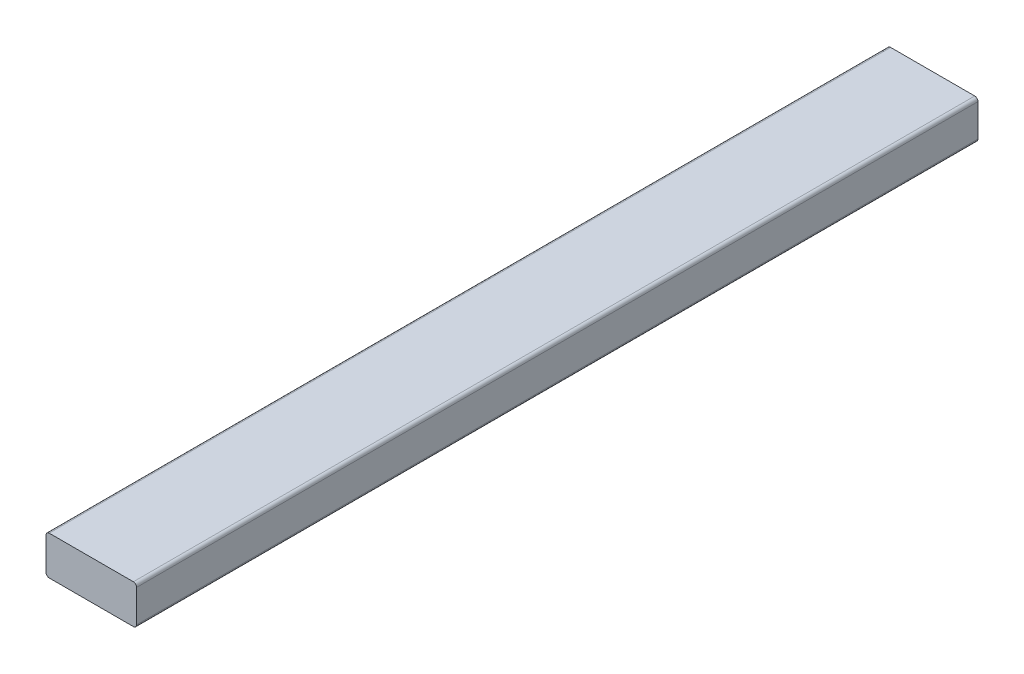
ISO-10303-21;
HEADER;
FILE_DESCRIPTION(('STEP AP214'),'2;1');
FILE_NAME('part.step','',(''),(''),'','','');
FILE_SCHEMA(('AUTOMOTIVE_DESIGN { 1 0 10303 214 1 1 1 1 }'));
ENDSEC;
DATA;
#1=APPLICATION_CONTEXT('core data for automotive mechanical design processes');
#2=APPLICATION_PROTOCOL_DEFINITION('international standard','automotive_design',2000,#1);
#3=PRODUCT_CONTEXT('',#1,'mechanical');
#4=PRODUCT('Part','Part','',(#3));
#5=PRODUCT_RELATED_PRODUCT_CATEGORY('part','',(#4));
#6=PRODUCT_DEFINITION_FORMATION('','',#4);
#7=PRODUCT_DEFINITION_CONTEXT('part definition',#1,'design');
#8=PRODUCT_DEFINITION('design','',#6,#7);
#9=PRODUCT_DEFINITION_SHAPE('','',#8);
#10=(LENGTH_UNIT() NAMED_UNIT(*) SI_UNIT(.MILLI.,.METRE.));
#11=(NAMED_UNIT(*) PLANE_ANGLE_UNIT() SI_UNIT($,.RADIAN.));
#12=(NAMED_UNIT(*) SI_UNIT($,.STERADIAN.) SOLID_ANGLE_UNIT());
#13=UNCERTAINTY_MEASURE_WITH_UNIT(LENGTH_MEASURE(1.E-05),#10,'distance_accuracy_value','');
#14=(GEOMETRIC_REPRESENTATION_CONTEXT(3) GLOBAL_UNCERTAINTY_ASSIGNED_CONTEXT((#13)) GLOBAL_UNIT_ASSIGNED_CONTEXT((#10,
#11,#12)) REPRESENTATION_CONTEXT('',''));
#15=CARTESIAN_POINT('',(0.,0.,0.));
#16=DIRECTION('',(0.,0.,1.));
#17=DIRECTION('',(1.,0.,0.));
#18=AXIS2_PLACEMENT_3D('',#15,#16,#17);
#19=CARTESIAN_POINT('',(44.45,19.05,412.75));
#20=DIRECTION('',(-1.,0.,0.));
#21=DIRECTION('',(0.,0.,1.));
#22=AXIS2_PLACEMENT_3D('',#19,#20,#21);
#23=PLANE('',#22);
#24=DIRECTION('',(0.,1.,0.));
#25=VECTOR('',#24,1.);
#26=CARTESIAN_POINT('',(44.45,19.05,412.75));
#27=LINE('',#26,#25);
#28=CARTESIAN_POINT('',(44.45,-15.875,412.75));
#29=VERTEX_POINT('',#28);
#30=CARTESIAN_POINT('',(44.45,15.875,412.75));
#31=VERTEX_POINT('',#30);
#32=EDGE_CURVE('E119',#29,#31,#27,.T.);
#33=ORIENTED_EDGE('',*,*,#32,.F.);
#34=DIRECTION('',(0.,0.,-1.));
#35=VECTOR('',#34,1.);
#36=CARTESIAN_POINT('',(44.45,-15.875,412.75));
#37=LINE('',#36,#35);
#38=CARTESIAN_POINT('',(44.45,-15.875,-412.75));
#39=VERTEX_POINT('',#38);
#40=EDGE_CURVE('E104',#29,#39,#37,.T.);
#41=ORIENTED_EDGE('',*,*,#40,.T.);
#42=DIRECTION('',(0.,1.,0.));
#43=VECTOR('',#42,1.);
#44=CARTESIAN_POINT('',(44.45,19.05,-412.75));
#45=LINE('',#44,#43);
#46=CARTESIAN_POINT('',(44.45,15.875,-412.75));
#47=VERTEX_POINT('',#46);
#48=EDGE_CURVE('E116',#39,#47,#45,.T.);
#49=ORIENTED_EDGE('',*,*,#48,.T.);
#50=DIRECTION('',(0.,0.,-1.));
#51=VECTOR('',#50,1.);
#52=CARTESIAN_POINT('',(44.45,15.875,412.75));
#53=LINE('',#52,#51);
#54=EDGE_CURVE('E121',#47,#31,#53,.F.);
#55=ORIENTED_EDGE('',*,*,#54,.T.);
#56=EDGE_LOOP('',(#33,#41,#49,#55));
#57=FACE_BOUND('',#56,.T.);
#58=ADVANCED_FACE('F34',(#57),#23,.F.);
#59=CARTESIAN_POINT('',(-44.45,19.05,412.75));
#60=DIRECTION('',(0.,-1.,0.));
#61=DIRECTION('',(0.,0.,-1.));
#62=AXIS2_PLACEMENT_3D('',#59,#60,#61);
#63=PLANE('',#62);
#64=DIRECTION('',(-1.,0.,0.));
#65=VECTOR('',#64,1.);
#66=CARTESIAN_POINT('',(-44.45,19.05,-412.75));
#67=LINE('',#66,#65);
#68=CARTESIAN_POINT('',(41.275,19.05,-412.75));
#69=VERTEX_POINT('',#68);
#70=CARTESIAN_POINT('',(-41.275,19.05,-412.75));
#71=VERTEX_POINT('',#70);
#72=EDGE_CURVE('E125',#69,#71,#67,.T.);
#73=ORIENTED_EDGE('',*,*,#72,.T.);
#74=DIRECTION('',(0.,0.,-1.));
#75=VECTOR('',#74,1.);
#76=CARTESIAN_POINT('',(-41.275,19.05,412.75));
#77=LINE('',#76,#75);
#78=CARTESIAN_POINT('',(-41.275,19.05,412.75));
#79=VERTEX_POINT('',#78);
#80=EDGE_CURVE('E11',#71,#79,#77,.F.);
#81=ORIENTED_EDGE('',*,*,#80,.T.);
#82=DIRECTION('',(-1.,0.,0.));
#83=VECTOR('',#82,1.);
#84=CARTESIAN_POINT('',(-44.45,19.05,412.75));
#85=LINE('',#84,#83);
#86=CARTESIAN_POINT('',(41.275,19.05,412.75));
#87=VERTEX_POINT('',#86);
#88=EDGE_CURVE('E161',#87,#79,#85,.T.);
#89=ORIENTED_EDGE('',*,*,#88,.F.);
#90=DIRECTION('',(0.,0.,-1.));
#91=VECTOR('',#90,1.);
#92=CARTESIAN_POINT('',(41.275,19.05,412.75));
#93=LINE('',#92,#91);
#94=EDGE_CURVE('E42',#87,#69,#93,.T.);
#95=ORIENTED_EDGE('',*,*,#94,.T.);
#96=EDGE_LOOP('',(#73,#81,#89,#95));
#97=FACE_BOUND('',#96,.T.);
#98=ADVANCED_FACE('F159',(#97),#63,.F.);
#99=CARTESIAN_POINT('',(-44.45,19.05,412.75));
#100=DIRECTION('',(1.,0.,0.));
#101=DIRECTION('',(0.,0.,-1.));
#102=AXIS2_PLACEMENT_3D('',#99,#100,#101);
#103=PLANE('',#102);
#104=DIRECTION('',(0.,-1.,0.));
#105=VECTOR('',#104,1.);
#106=CARTESIAN_POINT('',(-44.45,19.05,-412.75));
#107=LINE('',#106,#105);
#108=CARTESIAN_POINT('',(-44.45,15.875,-412.75));
#109=VERTEX_POINT('',#108);
#110=CARTESIAN_POINT('',(-44.45,-15.875,-412.75));
#111=VERTEX_POINT('',#110);
#112=EDGE_CURVE('E128',#109,#111,#107,.T.);
#113=ORIENTED_EDGE('',*,*,#112,.T.);
#114=DIRECTION('',(0.,0.,-1.));
#115=VECTOR('',#114,1.);
#116=CARTESIAN_POINT('',(-44.45,-15.875,412.75));
#117=LINE('',#116,#115);
#118=CARTESIAN_POINT('',(-44.45,-15.875,412.75));
#119=VERTEX_POINT('',#118);
#120=EDGE_CURVE('E49',#111,#119,#117,.F.);
#121=ORIENTED_EDGE('',*,*,#120,.T.);
#122=DIRECTION('',(0.,-1.,0.));
#123=VECTOR('',#122,1.);
#124=CARTESIAN_POINT('',(-44.45,19.05,412.75));
#125=LINE('',#124,#123);
#126=CARTESIAN_POINT('',(-44.45,15.875,412.75));
#127=VERTEX_POINT('',#126);
#128=EDGE_CURVE('E169',#127,#119,#125,.T.);
#129=ORIENTED_EDGE('',*,*,#128,.F.);
#130=DIRECTION('',(0.,0.,-1.));
#131=VECTOR('',#130,1.);
#132=CARTESIAN_POINT('',(-44.45,15.875,412.75));
#133=LINE('',#132,#131);
#134=EDGE_CURVE('E152',#127,#109,#133,.T.);
#135=ORIENTED_EDGE('',*,*,#134,.T.);
#136=EDGE_LOOP('',(#113,#121,#129,#135));
#137=FACE_BOUND('',#136,.T.);
#138=ADVANCED_FACE('F168',(#137),#103,.F.);
#139=CARTESIAN_POINT('',(-44.45,-19.05,412.75));
#140=DIRECTION('',(0.,1.,0.));
#141=DIRECTION('',(0.,0.,1.));
#142=AXIS2_PLACEMENT_3D('',#139,#140,#141);
#143=PLANE('',#142);
#144=DIRECTION('',(1.,0.,0.));
#145=VECTOR('',#144,1.);
#146=CARTESIAN_POINT('',(-44.45,-19.05,-412.75));
#147=LINE('',#146,#145);
#148=CARTESIAN_POINT('',(-41.275,-19.05,-412.75));
#149=VERTEX_POINT('',#148);
#150=CARTESIAN_POINT('',(41.275,-19.05,-412.75));
#151=VERTEX_POINT('',#150);
#152=EDGE_CURVE('E135',#149,#151,#147,.T.);
#153=ORIENTED_EDGE('',*,*,#152,.T.);
#154=DIRECTION('',(0.,0.,-1.));
#155=VECTOR('',#154,1.);
#156=CARTESIAN_POINT('',(41.275,-19.05,412.75));
#157=LINE('',#156,#155);
#158=CARTESIAN_POINT('',(41.275,-19.05,412.75));
#159=VERTEX_POINT('',#158);
#160=EDGE_CURVE('E105',#151,#159,#157,.F.);
#161=ORIENTED_EDGE('',*,*,#160,.T.);
#162=DIRECTION('',(1.,0.,0.));
#163=VECTOR('',#162,1.);
#164=CARTESIAN_POINT('',(-44.45,-19.05,412.75));
#165=LINE('',#164,#163);
#166=CARTESIAN_POINT('',(-41.275,-19.05,412.75));
#167=VERTEX_POINT('',#166);
#168=EDGE_CURVE('E131',#167,#159,#165,.T.);
#169=ORIENTED_EDGE('',*,*,#168,.F.);
#170=DIRECTION('',(0.,0.,-1.));
#171=VECTOR('',#170,1.);
#172=CARTESIAN_POINT('',(-41.275,-19.05,412.75));
#173=LINE('',#172,#171);
#174=EDGE_CURVE('E110',#167,#149,#173,.T.);
#175=ORIENTED_EDGE('',*,*,#174,.T.);
#176=EDGE_LOOP('',(#153,#161,#169,#175));
#177=FACE_BOUND('',#176,.T.);
#178=ADVANCED_FACE('F197',(#177),#143,.F.);
#179=CARTESIAN_POINT('',(0.,0.,412.75));
#180=DIRECTION('',(0.,0.,1.));
#181=DIRECTION('',(1.,0.,0.));
#182=AXIS2_PLACEMENT_3D('',#179,#180,#181);
#183=PLANE('',#182);
#184=ORIENTED_EDGE('',*,*,#168,.T.);
#185=CARTESIAN_POINT('',(41.275,-15.875,412.75));
#186=DIRECTION('',(0.,0.,1.));
#187=DIRECTION('',(1.,0.,0.));
#188=AXIS2_PLACEMENT_3D('',#185,#186,#187);
#189=CIRCLE('',#188,3.175);
#190=EDGE_CURVE('E150',#159,#29,#189,.T.);
#191=ORIENTED_EDGE('',*,*,#190,.T.);
#192=ORIENTED_EDGE('',*,*,#32,.T.);
#193=CARTESIAN_POINT('',(41.275,15.875,412.75));
#194=DIRECTION('',(0.,0.,1.));
#195=DIRECTION('',(1.,0.,0.));
#196=AXIS2_PLACEMENT_3D('',#193,#194,#195);
#197=CIRCLE('',#196,3.175);
#198=EDGE_CURVE('E145',#31,#87,#197,.T.);
#199=ORIENTED_EDGE('',*,*,#198,.T.);
#200=ORIENTED_EDGE('',*,*,#88,.T.);
#201=CARTESIAN_POINT('',(-41.275,15.875,412.75));
#202=DIRECTION('',(0.,0.,1.));
#203=DIRECTION('',(1.,0.,0.));
#204=AXIS2_PLACEMENT_3D('',#201,#202,#203);
#205=CIRCLE('',#204,3.175);
#206=EDGE_CURVE('E56',#79,#127,#205,.T.);
#207=ORIENTED_EDGE('',*,*,#206,.T.);
#208=ORIENTED_EDGE('',*,*,#128,.T.);
#209=CARTESIAN_POINT('',(-41.275,-15.875,412.75));
#210=DIRECTION('',(0.,0.,1.));
#211=DIRECTION('',(1.,0.,0.));
#212=AXIS2_PLACEMENT_3D('',#209,#210,#211);
#213=CIRCLE('',#212,3.175);
#214=EDGE_CURVE('E148',#119,#167,#213,.T.);
#215=ORIENTED_EDGE('',*,*,#214,.T.);
#216=EDGE_LOOP('',(#184,#191,#192,#199,#200,#207,#208,#215));
#217=FACE_BOUND('',#216,.T.);
#218=ADVANCED_FACE('F174',(#217),#183,.T.);
#219=CARTESIAN_POINT('',(0.,0.,-412.75));
#220=DIRECTION('',(0.,0.,1.));
#221=DIRECTION('',(1.,0.,0.));
#222=AXIS2_PLACEMENT_3D('',#219,#220,#221);
#223=PLANE('',#222);
#224=ORIENTED_EDGE('',*,*,#48,.F.);
#225=CARTESIAN_POINT('',(41.275,-15.875,-412.75));
#226=DIRECTION('',(0.,0.,1.));
#227=DIRECTION('',(1.,0.,0.));
#228=AXIS2_PLACEMENT_3D('',#225,#226,#227);
#229=CIRCLE('',#228,3.175);
#230=EDGE_CURVE('E100',#39,#151,#229,.F.);
#231=ORIENTED_EDGE('',*,*,#230,.T.);
#232=ORIENTED_EDGE('',*,*,#152,.F.);
#233=CARTESIAN_POINT('',(-41.275,-15.875,-412.75));
#234=DIRECTION('',(0.,0.,1.));
#235=DIRECTION('',(1.,0.,0.));
#236=AXIS2_PLACEMENT_3D('',#233,#234,#235);
#237=CIRCLE('',#236,3.175);
#238=EDGE_CURVE('E111',#149,#111,#237,.F.);
#239=ORIENTED_EDGE('',*,*,#238,.T.);
#240=ORIENTED_EDGE('',*,*,#112,.F.);
#241=CARTESIAN_POINT('',(-41.275,15.875,-412.75));
#242=DIRECTION('',(0.,0.,1.));
#243=DIRECTION('',(1.,0.,0.));
#244=AXIS2_PLACEMENT_3D('',#241,#242,#243);
#245=CIRCLE('',#244,3.175);
#246=EDGE_CURVE('E139',#109,#71,#245,.F.);
#247=ORIENTED_EDGE('',*,*,#246,.T.);
#248=ORIENTED_EDGE('',*,*,#72,.F.);
#249=CARTESIAN_POINT('',(41.275,15.875,-412.75));
#250=DIRECTION('',(0.,0.,1.));
#251=DIRECTION('',(1.,0.,0.));
#252=AXIS2_PLACEMENT_3D('',#249,#250,#251);
#253=CIRCLE('',#252,3.175);
#254=EDGE_CURVE('E120',#69,#47,#253,.F.);
#255=ORIENTED_EDGE('',*,*,#254,.T.);
#256=EDGE_LOOP('',(#224,#231,#232,#239,#240,#247,#248,#255));
#257=FACE_BOUND('',#256,.T.);
#258=ADVANCED_FACE('F123',(#257),#223,.F.);
#259=CARTESIAN_POINT('',(41.275,-15.875,412.75));
#260=DIRECTION('',(0.,0.,-1.));
#261=DIRECTION('',(-1.,0.,0.));
#262=AXIS2_PLACEMENT_3D('',#259,#260,#261);
#263=CYLINDRICAL_SURFACE('',#262,3.175);
#264=ORIENTED_EDGE('',*,*,#190,.F.);
#265=ORIENTED_EDGE('',*,*,#160,.F.);
#266=ORIENTED_EDGE('',*,*,#230,.F.);
#267=ORIENTED_EDGE('',*,*,#40,.F.);
#268=EDGE_LOOP('',(#264,#265,#266,#267));
#269=FACE_BOUND('',#268,.T.);
#270=ADVANCED_FACE('F103',(#269),#263,.T.);
#271=CARTESIAN_POINT('',(-41.275,-15.875,412.75));
#272=DIRECTION('',(0.,0.,-1.));
#273=DIRECTION('',(-1.,0.,0.));
#274=AXIS2_PLACEMENT_3D('',#271,#272,#273);
#275=CYLINDRICAL_SURFACE('',#274,3.175);
#276=ORIENTED_EDGE('',*,*,#214,.F.);
#277=ORIENTED_EDGE('',*,*,#120,.F.);
#278=ORIENTED_EDGE('',*,*,#238,.F.);
#279=ORIENTED_EDGE('',*,*,#174,.F.);
#280=EDGE_LOOP('',(#276,#277,#278,#279));
#281=FACE_BOUND('',#280,.T.);
#282=ADVANCED_FACE('F179',(#281),#275,.T.);
#283=CARTESIAN_POINT('',(-41.275,15.875,412.75));
#284=DIRECTION('',(0.,0.,-1.));
#285=DIRECTION('',(-1.,0.,0.));
#286=AXIS2_PLACEMENT_3D('',#283,#284,#285);
#287=CYLINDRICAL_SURFACE('',#286,3.175);
#288=ORIENTED_EDGE('',*,*,#206,.F.);
#289=ORIENTED_EDGE('',*,*,#80,.F.);
#290=ORIENTED_EDGE('',*,*,#246,.F.);
#291=ORIENTED_EDGE('',*,*,#134,.F.);
#292=EDGE_LOOP('',(#288,#289,#290,#291));
#293=FACE_BOUND('',#292,.T.);
#294=ADVANCED_FACE('F167',(#293),#287,.T.);
#295=CARTESIAN_POINT('',(41.275,15.875,412.75));
#296=DIRECTION('',(0.,0.,-1.));
#297=DIRECTION('',(-1.,0.,0.));
#298=AXIS2_PLACEMENT_3D('',#295,#296,#297);
#299=CYLINDRICAL_SURFACE('',#298,3.175);
#300=ORIENTED_EDGE('',*,*,#198,.F.);
#301=ORIENTED_EDGE('',*,*,#54,.F.);
#302=ORIENTED_EDGE('',*,*,#254,.F.);
#303=ORIENTED_EDGE('',*,*,#94,.F.);
#304=EDGE_LOOP('',(#300,#301,#302,#303));
#305=FACE_BOUND('',#304,.T.);
#306=ADVANCED_FACE('F36',(#305),#299,.T.);
#307=CLOSED_SHELL('',(#58,#98,#138,#178,#218,#258,#270,#282,#294,#306));
#308=MANIFOLD_SOLID_BREP('B2',#307);
#309=ADVANCED_BREP_SHAPE_REPRESENTATION('',(#18,#308),#14);
#310=SHAPE_DEFINITION_REPRESENTATION(#9,#309);
ENDSEC;
END-ISO-10303-21;
